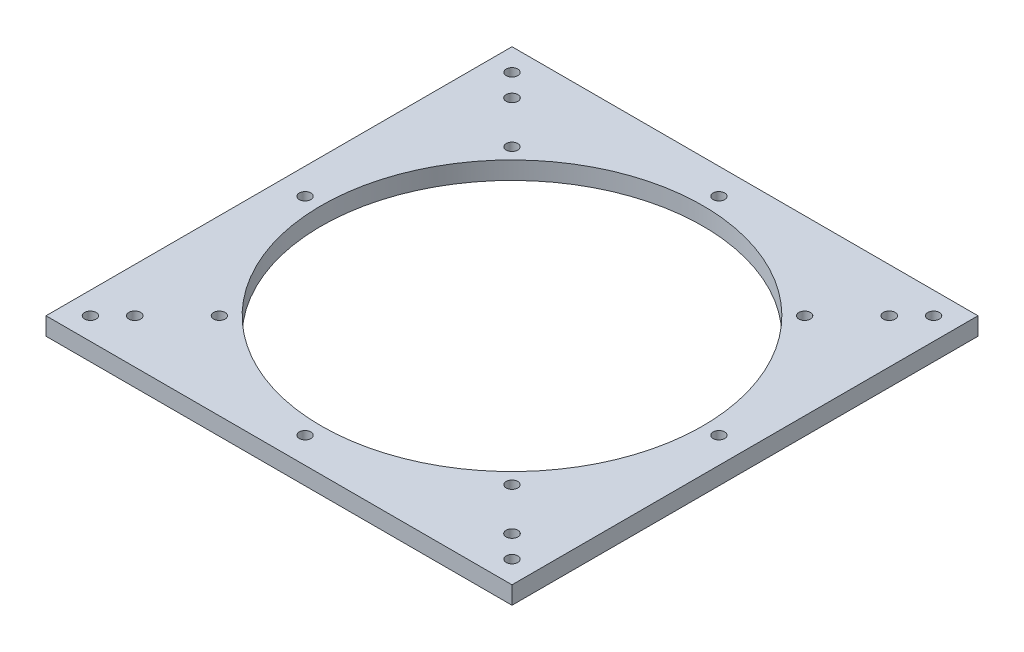
ISO-10303-21;
HEADER;
FILE_DESCRIPTION(('STEP AP214'),'2;1');
FILE_NAME('part.step','',(''),(''),'','','');
FILE_SCHEMA(('AUTOMOTIVE_DESIGN { 1 0 10303 214 1 1 1 1 }'));
ENDSEC;
DATA;
#1=APPLICATION_CONTEXT('core data for automotive mechanical design processes');
#2=APPLICATION_PROTOCOL_DEFINITION('international standard','automotive_design',2000,#1);
#3=PRODUCT_CONTEXT('',#1,'mechanical');
#4=PRODUCT('Part','Part','',(#3));
#5=PRODUCT_RELATED_PRODUCT_CATEGORY('part','',(#4));
#6=PRODUCT_DEFINITION_FORMATION('','',#4);
#7=PRODUCT_DEFINITION_CONTEXT('part definition',#1,'design');
#8=PRODUCT_DEFINITION('design','',#6,#7);
#9=PRODUCT_DEFINITION_SHAPE('','',#8);
#10=(LENGTH_UNIT() NAMED_UNIT(*) SI_UNIT(.MILLI.,.METRE.));
#11=(NAMED_UNIT(*) PLANE_ANGLE_UNIT() SI_UNIT($,.RADIAN.));
#12=(NAMED_UNIT(*) SI_UNIT($,.STERADIAN.) SOLID_ANGLE_UNIT());
#13=UNCERTAINTY_MEASURE_WITH_UNIT(LENGTH_MEASURE(1.E-05),#10,'distance_accuracy_value','');
#14=(GEOMETRIC_REPRESENTATION_CONTEXT(3) GLOBAL_UNCERTAINTY_ASSIGNED_CONTEXT((#13)) GLOBAL_UNIT_ASSIGNED_CONTEXT((#10,
#11,#12)) REPRESENTATION_CONTEXT('',''));
#15=CARTESIAN_POINT('',(0.,0.,0.));
#16=DIRECTION('',(0.,0.,1.));
#17=DIRECTION('',(1.,0.,0.));
#18=AXIS2_PLACEMENT_3D('',#15,#16,#17);
#19=CARTESIAN_POINT('',(0.,8.,105.));
#20=DIRECTION('',(0.,0.,-1.));
#21=DIRECTION('',(-1.,0.,0.));
#22=AXIS2_PLACEMENT_3D('',#19,#20,#21);
#23=PLANE('',#22);
#24=DIRECTION('',(1.,0.,0.));
#25=VECTOR('',#24,1.);
#26=CARTESIAN_POINT('',(0.,0.,105.));
#27=LINE('',#26,#25);
#28=CARTESIAN_POINT('',(-105.,0.,105.));
#29=VERTEX_POINT('',#28);
#30=CARTESIAN_POINT('',(105.,0.,105.));
#31=VERTEX_POINT('',#30);
#32=EDGE_CURVE('E134',#29,#31,#27,.T.);
#33=ORIENTED_EDGE('',*,*,#32,.T.);
#34=DIRECTION('',(0.,-1.,0.));
#35=VECTOR('',#34,1.);
#36=CARTESIAN_POINT('',(105.,8.,105.));
#37=LINE('',#36,#35);
#38=CARTESIAN_POINT('',(105.,8.,105.));
#39=VERTEX_POINT('',#38);
#40=EDGE_CURVE('E11',#39,#31,#37,.T.);
#41=ORIENTED_EDGE('',*,*,#40,.F.);
#42=DIRECTION('',(1.,0.,0.));
#43=VECTOR('',#42,1.);
#44=CARTESIAN_POINT('',(0.,8.,105.));
#45=LINE('',#44,#43);
#46=CARTESIAN_POINT('',(-105.,8.,105.));
#47=VERTEX_POINT('',#46);
#48=EDGE_CURVE('E99',#47,#39,#45,.T.);
#49=ORIENTED_EDGE('',*,*,#48,.F.);
#50=DIRECTION('',(0.,-1.,0.));
#51=VECTOR('',#50,1.);
#52=CARTESIAN_POINT('',(-105.,8.,105.));
#53=LINE('',#52,#51);
#54=EDGE_CURVE('E65',#47,#29,#53,.T.);
#55=ORIENTED_EDGE('',*,*,#54,.T.);
#56=EDGE_LOOP('',(#33,#41,#49,#55));
#57=FACE_BOUND('',#56,.T.);
#58=ADVANCED_FACE('F46',(#57),#23,.F.);
#59=CARTESIAN_POINT('',(105.,8.,0.));
#60=DIRECTION('',(-1.,0.,0.));
#61=DIRECTION('',(0.,0.,1.));
#62=AXIS2_PLACEMENT_3D('',#59,#60,#61);
#63=PLANE('',#62);
#64=DIRECTION('',(0.,0.,-1.));
#65=VECTOR('',#64,1.);
#66=CARTESIAN_POINT('',(105.,0.,0.));
#67=LINE('',#66,#65);
#68=CARTESIAN_POINT('',(105.,0.,-105.));
#69=VERTEX_POINT('',#68);
#70=EDGE_CURVE('E105',#31,#69,#67,.T.);
#71=ORIENTED_EDGE('',*,*,#70,.T.);
#72=DIRECTION('',(0.,-1.,0.));
#73=VECTOR('',#72,1.);
#74=CARTESIAN_POINT('',(105.,8.,-105.));
#75=LINE('',#74,#73);
#76=CARTESIAN_POINT('',(105.,8.,-105.));
#77=VERTEX_POINT('',#76);
#78=EDGE_CURVE('E56',#77,#69,#75,.T.);
#79=ORIENTED_EDGE('',*,*,#78,.F.);
#80=DIRECTION('',(0.,0.,-1.));
#81=VECTOR('',#80,1.);
#82=CARTESIAN_POINT('',(105.,8.,0.));
#83=LINE('',#82,#81);
#84=EDGE_CURVE('E90',#39,#77,#83,.T.);
#85=ORIENTED_EDGE('',*,*,#84,.F.);
#86=ORIENTED_EDGE('',*,*,#40,.T.);
#87=EDGE_LOOP('',(#71,#79,#85,#86));
#88=FACE_BOUND('',#87,.T.);
#89=ADVANCED_FACE('F104',(#88),#63,.F.);
#90=CARTESIAN_POINT('',(0.,8.,-105.));
#91=DIRECTION('',(0.,0.,-1.));
#92=DIRECTION('',(-1.,0.,0.));
#93=AXIS2_PLACEMENT_3D('',#90,#91,#92);
#94=PLANE('',#93);
#95=DIRECTION('',(1.,0.,0.));
#96=VECTOR('',#95,1.);
#97=CARTESIAN_POINT('',(0.,0.,-105.));
#98=LINE('',#97,#96);
#99=CARTESIAN_POINT('',(-105.,0.,-105.));
#100=VERTEX_POINT('',#99);
#101=EDGE_CURVE('E140',#100,#69,#98,.T.);
#102=ORIENTED_EDGE('',*,*,#101,.F.);
#103=DIRECTION('',(0.,-1.,0.));
#104=VECTOR('',#103,1.);
#105=CARTESIAN_POINT('',(-105.,8.,-105.));
#106=LINE('',#105,#104);
#107=CARTESIAN_POINT('',(-105.,8.,-105.));
#108=VERTEX_POINT('',#107);
#109=EDGE_CURVE('E79',#108,#100,#106,.T.);
#110=ORIENTED_EDGE('',*,*,#109,.F.);
#111=DIRECTION('',(1.,0.,0.));
#112=VECTOR('',#111,1.);
#113=CARTESIAN_POINT('',(0.,8.,-105.));
#114=LINE('',#113,#112);
#115=EDGE_CURVE('E98',#108,#77,#114,.T.);
#116=ORIENTED_EDGE('',*,*,#115,.T.);
#117=ORIENTED_EDGE('',*,*,#78,.T.);
#118=EDGE_LOOP('',(#102,#110,#116,#117));
#119=FACE_BOUND('',#118,.T.);
#120=ADVANCED_FACE('F110',(#119),#94,.T.);
#121=CARTESIAN_POINT('',(-6.51161269694244E-13,8.,93.25));
#122=DIRECTION('',(0.,-1.,0.));
#123=DIRECTION('',(0.,0.,-1.));
#124=AXIS2_PLACEMENT_3D('',#121,#122,#123);
#125=CYLINDRICAL_SURFACE('',#124,2.6);
#126=CARTESIAN_POINT('',(-6.51161269694244E-13,8.,93.25));
#127=DIRECTION('',(0.,1.,0.));
#128=DIRECTION('',(0.,0.,1.));
#129=AXIS2_PLACEMENT_3D('',#126,#127,#128);
#130=CIRCLE('',#129,2.6);
#131=CARTESIAN_POINT('',(-6.51161269694244E-13,8.,95.85));
#132=VERTEX_POINT('',#131);
#133=EDGE_CURVE('E126',#132,#132,#130,.T.);
#134=ORIENTED_EDGE('',*,*,#133,.T.);
#135=EDGE_LOOP('',(#134));
#136=FACE_BOUND('',#135,.T.);
#137=CARTESIAN_POINT('',(-6.51161269694244E-13,0.,93.25));
#138=DIRECTION('',(0.,1.,0.));
#139=DIRECTION('',(0.,0.,1.));
#140=AXIS2_PLACEMENT_3D('',#137,#138,#139);
#141=CIRCLE('',#140,2.6);
#142=CARTESIAN_POINT('',(-6.51161269694244E-13,0.,95.85));
#143=VERTEX_POINT('',#142);
#144=EDGE_CURVE('E155',#143,#143,#141,.T.);
#145=ORIENTED_EDGE('',*,*,#144,.F.);
#146=EDGE_LOOP('',(#145));
#147=FACE_BOUND('',#146,.T.);
#148=ADVANCED_FACE('F243',(#136,#147),#125,.F.);
#149=CARTESIAN_POINT('',(-93.25,8.,-9.76741904541367E-13));
#150=DIRECTION('',(0.,-1.,0.));
#151=DIRECTION('',(0.,0.,-1.));
#152=AXIS2_PLACEMENT_3D('',#149,#150,#151);
#153=CYLINDRICAL_SURFACE('',#152,2.6);
#154=CARTESIAN_POINT('',(-93.25,8.,-9.76741904541367E-13));
#155=DIRECTION('',(0.,1.,0.));
#156=DIRECTION('',(0.,0.,1.));
#157=AXIS2_PLACEMENT_3D('',#154,#155,#156);
#158=CIRCLE('',#157,2.6);
#159=CARTESIAN_POINT('',(-93.25,8.,2.59999999999902));
#160=VERTEX_POINT('',#159);
#161=EDGE_CURVE('E122',#160,#160,#158,.T.);
#162=ORIENTED_EDGE('',*,*,#161,.T.);
#163=EDGE_LOOP('',(#162));
#164=FACE_BOUND('',#163,.T.);
#165=CARTESIAN_POINT('',(-93.25,0.,-9.76741904541367E-13));
#166=DIRECTION('',(0.,1.,0.));
#167=DIRECTION('',(0.,0.,1.));
#168=AXIS2_PLACEMENT_3D('',#165,#166,#167);
#169=CIRCLE('',#168,2.6);
#170=CARTESIAN_POINT('',(-93.25,0.,2.59999999999902));
#171=VERTEX_POINT('',#170);
#172=EDGE_CURVE('E151',#171,#171,#169,.T.);
#173=ORIENTED_EDGE('',*,*,#172,.F.);
#174=EDGE_LOOP('',(#173));
#175=FACE_BOUND('',#174,.T.);
#176=ADVANCED_FACE('F237',(#164,#175),#153,.F.);
#177=CARTESIAN_POINT('',(0.,8.,-93.25));
#178=DIRECTION('',(0.,-1.,0.));
#179=DIRECTION('',(0.,0.,-1.));
#180=AXIS2_PLACEMENT_3D('',#177,#178,#179);
#181=CYLINDRICAL_SURFACE('',#180,2.6);
#182=CARTESIAN_POINT('',(0.,8.,-93.25));
#183=DIRECTION('',(0.,1.,0.));
#184=DIRECTION('',(0.,0.,1.));
#185=AXIS2_PLACEMENT_3D('',#182,#183,#184);
#186=CIRCLE('',#185,2.6);
#187=CARTESIAN_POINT('',(0.,8.,-90.65));
#188=VERTEX_POINT('',#187);
#189=EDGE_CURVE('E115',#188,#188,#186,.T.);
#190=ORIENTED_EDGE('',*,*,#189,.T.);
#191=EDGE_LOOP('',(#190));
#192=FACE_BOUND('',#191,.T.);
#193=CARTESIAN_POINT('',(0.,0.,-93.25));
#194=DIRECTION('',(0.,1.,0.));
#195=DIRECTION('',(0.,0.,1.));
#196=AXIS2_PLACEMENT_3D('',#193,#194,#195);
#197=CIRCLE('',#196,2.6);
#198=CARTESIAN_POINT('',(0.,0.,-90.65));
#199=VERTEX_POINT('',#198);
#200=EDGE_CURVE('E147',#199,#199,#197,.T.);
#201=ORIENTED_EDGE('',*,*,#200,.F.);
#202=EDGE_LOOP('',(#201));
#203=FACE_BOUND('',#202,.T.);
#204=ADVANCED_FACE('F229',(#192,#203),#181,.F.);
#205=CARTESIAN_POINT('',(-105.,8.,0.));
#206=DIRECTION('',(-1.,0.,0.));
#207=DIRECTION('',(0.,0.,1.));
#208=AXIS2_PLACEMENT_3D('',#205,#206,#207);
#209=PLANE('',#208);
#210=DIRECTION('',(0.,0.,-1.));
#211=VECTOR('',#210,1.);
#212=CARTESIAN_POINT('',(-105.,0.,0.));
#213=LINE('',#212,#211);
#214=EDGE_CURVE('E143',#29,#100,#213,.T.);
#215=ORIENTED_EDGE('',*,*,#214,.F.);
#216=ORIENTED_EDGE('',*,*,#54,.F.);
#217=DIRECTION('',(0.,0.,-1.));
#218=VECTOR('',#217,1.);
#219=CARTESIAN_POINT('',(-105.,8.,0.));
#220=LINE('',#219,#218);
#221=EDGE_CURVE('E112',#47,#108,#220,.T.);
#222=ORIENTED_EDGE('',*,*,#221,.T.);
#223=ORIENTED_EDGE('',*,*,#109,.T.);
#224=EDGE_LOOP('',(#215,#216,#222,#223));
#225=FACE_BOUND('',#224,.T.);
#226=ADVANCED_FACE('F226',(#225),#209,.T.);
#227=CARTESIAN_POINT('',(93.25,8.,3.25580634847122E-13));
#228=DIRECTION('',(0.,-1.,0.));
#229=DIRECTION('',(0.,0.,-1.));
#230=AXIS2_PLACEMENT_3D('',#227,#228,#229);
#231=CYLINDRICAL_SURFACE('',#230,2.6);
#232=CARTESIAN_POINT('',(93.25,8.,3.25580634847122E-13));
#233=DIRECTION('',(0.,1.,0.));
#234=DIRECTION('',(0.,0.,1.));
#235=AXIS2_PLACEMENT_3D('',#232,#233,#234);
#236=CIRCLE('',#235,2.6);
#237=CARTESIAN_POINT('',(93.25,8.,2.60000000000033));
#238=VERTEX_POINT('',#237);
#239=EDGE_CURVE('E130',#238,#238,#236,.T.);
#240=ORIENTED_EDGE('',*,*,#239,.T.);
#241=EDGE_LOOP('',(#240));
#242=FACE_BOUND('',#241,.T.);
#243=CARTESIAN_POINT('',(93.25,0.,3.25580634847122E-13));
#244=DIRECTION('',(0.,1.,0.));
#245=DIRECTION('',(0.,0.,1.));
#246=AXIS2_PLACEMENT_3D('',#243,#244,#245);
#247=CIRCLE('',#246,2.6);
#248=CARTESIAN_POINT('',(93.25,0.,2.60000000000033));
#249=VERTEX_POINT('',#248);
#250=EDGE_CURVE('E159',#249,#249,#247,.T.);
#251=ORIENTED_EDGE('',*,*,#250,.F.);
#252=EDGE_LOOP('',(#251));
#253=FACE_BOUND('',#252,.T.);
#254=ADVANCED_FACE('F228',(#242,#253),#231,.F.);
#255=CARTESIAN_POINT('',(0.,8.,0.));
#256=DIRECTION('',(0.,1.,0.));
#257=DIRECTION('',(0.,0.,1.));
#258=AXIS2_PLACEMENT_3D('',#255,#256,#257);
#259=PLANE('',#258);
#260=CARTESIAN_POINT('',(84.9999999999993,8.,85.0000000000006));
#261=DIRECTION('',(0.,1.,0.));
#262=DIRECTION('',(0.,0.,1.));
#263=AXIS2_PLACEMENT_3D('',#260,#261,#262);
#264=CIRCLE('',#263,2.64999999999999);
#265=CARTESIAN_POINT('',(84.9999999999993,8.,87.6500000000005));
#266=VERTEX_POINT('',#265);
#267=EDGE_CURVE('E346',#266,#266,#264,.T.);
#268=ORIENTED_EDGE('',*,*,#267,.F.);
#269=EDGE_LOOP('',(#268));
#270=FACE_BOUND('',#269,.T.);
#271=CARTESIAN_POINT('',(-85.,8.,-85.));
#272=DIRECTION('',(0.,1.,0.));
#273=DIRECTION('',(0.,0.,1.));
#274=AXIS2_PLACEMENT_3D('',#271,#272,#273);
#275=CIRCLE('',#274,2.65);
#276=CARTESIAN_POINT('',(-85.,8.,-82.35));
#277=VERTEX_POINT('',#276);
#278=EDGE_CURVE('E336',#277,#277,#275,.T.);
#279=ORIENTED_EDGE('',*,*,#278,.F.);
#280=EDGE_LOOP('',(#279));
#281=FACE_BOUND('',#280,.T.);
#282=CARTESIAN_POINT('',(-85.0000000000009,8.,84.9999999999991));
#283=DIRECTION('',(0.,1.,0.));
#284=DIRECTION('',(0.,0.,1.));
#285=AXIS2_PLACEMENT_3D('',#282,#283,#284);
#286=CIRCLE('',#285,2.65000000000001);
#287=CARTESIAN_POINT('',(-85.0000000000009,8.,87.6499999999991));
#288=VERTEX_POINT('',#287);
#289=EDGE_CURVE('E326',#288,#288,#286,.T.);
#290=ORIENTED_EDGE('',*,*,#289,.F.);
#291=EDGE_LOOP('',(#290));
#292=FACE_BOUND('',#291,.T.);
#293=CARTESIAN_POINT('',(85.0000000000003,8.,-84.9999999999997));
#294=DIRECTION('',(0.,1.,0.));
#295=DIRECTION('',(0.,0.,1.));
#296=AXIS2_PLACEMENT_3D('',#293,#294,#295);
#297=CIRCLE('',#296,2.65000000000001);
#298=CARTESIAN_POINT('',(85.0000000000003,8.,-82.3499999999996));
#299=VERTEX_POINT('',#298);
#300=EDGE_CURVE('E329',#299,#299,#297,.T.);
#301=ORIENTED_EDGE('',*,*,#300,.F.);
#302=EDGE_LOOP('',(#301));
#303=FACE_BOUND('',#302,.T.);
#304=CARTESIAN_POINT('',(0.,8.,0.));
#305=DIRECTION('',(0.,1.,0.));
#306=DIRECTION('',(0.,0.,1.));
#307=AXIS2_PLACEMENT_3D('',#304,#305,#306);
#308=CIRCLE('',#307,86.);
#309=CARTESIAN_POINT('',(0.,8.,86.));
#310=VERTEX_POINT('',#309);
#311=EDGE_CURVE('E356',#310,#310,#308,.T.);
#312=ORIENTED_EDGE('',*,*,#311,.F.);
#313=EDGE_LOOP('',(#312));
#314=FACE_BOUND('',#313,.T.);
#315=CARTESIAN_POINT('',(-65.9377073456461,8.,65.937707345645));
#316=DIRECTION('',(0.,1.,0.));
#317=DIRECTION('',(0.,0.,1.));
#318=AXIS2_PLACEMENT_3D('',#315,#316,#317);
#319=CIRCLE('',#318,2.59999999999999);
#320=CARTESIAN_POINT('',(-65.9377073456461,8.,68.537707345645));
#321=VERTEX_POINT('',#320);
#322=EDGE_CURVE('E365',#321,#321,#319,.T.);
#323=ORIENTED_EDGE('',*,*,#322,.F.);
#324=EDGE_LOOP('',(#323));
#325=FACE_BOUND('',#324,.T.);
#326=CARTESIAN_POINT('',(65.9377073456457,8.,-65.9377073456454));
#327=DIRECTION('',(0.,1.,0.));
#328=DIRECTION('',(0.,0.,1.));
#329=AXIS2_PLACEMENT_3D('',#326,#327,#328);
#330=CIRCLE('',#329,2.59999999999999);
#331=CARTESIAN_POINT('',(65.9377073456457,8.,-63.3377073456454));
#332=VERTEX_POINT('',#331);
#333=EDGE_CURVE('E373',#332,#332,#330,.T.);
#334=ORIENTED_EDGE('',*,*,#333,.F.);
#335=EDGE_LOOP('',(#334));
#336=FACE_BOUND('',#335,.T.);
#337=CARTESIAN_POINT('',(-65.9377073456447,8.,-65.9377073456464));
#338=DIRECTION('',(0.,1.,0.));
#339=DIRECTION('',(0.,0.,1.));
#340=AXIS2_PLACEMENT_3D('',#337,#338,#339);
#341=CIRCLE('',#340,2.6);
#342=CARTESIAN_POINT('',(-65.9377073456447,8.,-63.3377073456464));
#343=VERTEX_POINT('',#342);
#344=EDGE_CURVE('E377',#343,#343,#341,.T.);
#345=ORIENTED_EDGE('',*,*,#344,.F.);
#346=EDGE_LOOP('',(#345));
#347=FACE_BOUND('',#346,.T.);
#348=CARTESIAN_POINT('',(95.0000000000003,8.,-94.9999999999996));
#349=DIRECTION('',(0.,1.,0.));
#350=DIRECTION('',(0.,0.,1.));
#351=AXIS2_PLACEMENT_3D('',#348,#349,#350);
#352=CIRCLE('',#351,2.6);
#353=CARTESIAN_POINT('',(95.0000000000003,8.,-92.3999999999996));
#354=VERTEX_POINT('',#353);
#355=EDGE_CURVE('E281',#354,#354,#352,.T.);
#356=ORIENTED_EDGE('',*,*,#355,.F.);
#357=EDGE_LOOP('',(#356));
#358=FACE_BOUND('',#357,.T.);
#359=CARTESIAN_POINT('',(94.9999999999993,8.,95.0000000000007));
#360=DIRECTION('',(0.,1.,0.));
#361=DIRECTION('',(0.,0.,1.));
#362=AXIS2_PLACEMENT_3D('',#359,#360,#361);
#363=CIRCLE('',#362,2.6);
#364=CARTESIAN_POINT('',(94.9999999999993,8.,97.6000000000007));
#365=VERTEX_POINT('',#364);
#366=EDGE_CURVE('E361',#365,#365,#363,.T.);
#367=ORIENTED_EDGE('',*,*,#366,.F.);
#368=EDGE_LOOP('',(#367));
#369=FACE_BOUND('',#368,.T.);
#370=CARTESIAN_POINT('',(-95.000000000001,8.,94.9999999999989));
#371=DIRECTION('',(0.,1.,0.));
#372=DIRECTION('',(0.,0.,1.));
#373=AXIS2_PLACEMENT_3D('',#370,#371,#372);
#374=CIRCLE('',#373,2.6);
#375=CARTESIAN_POINT('',(-95.000000000001,8.,97.599999999999));
#376=VERTEX_POINT('',#375);
#377=EDGE_CURVE('E366',#376,#376,#374,.T.);
#378=ORIENTED_EDGE('',*,*,#377,.F.);
#379=EDGE_LOOP('',(#378));
#380=FACE_BOUND('',#379,.T.);
#381=CARTESIAN_POINT('',(-95.,8.,-95.));
#382=DIRECTION('',(0.,1.,0.));
#383=DIRECTION('',(0.,0.,1.));
#384=AXIS2_PLACEMENT_3D('',#381,#382,#383);
#385=CIRCLE('',#384,2.6);
#386=CARTESIAN_POINT('',(-95.,8.,-92.4));
#387=VERTEX_POINT('',#386);
#388=EDGE_CURVE('E370',#387,#387,#385,.T.);
#389=ORIENTED_EDGE('',*,*,#388,.F.);
#390=EDGE_LOOP('',(#389));
#391=FACE_BOUND('',#390,.T.);
#392=CARTESIAN_POINT('',(65.9377073456452,8.,65.9377073456459));
#393=DIRECTION('',(0.,1.,0.));
#394=DIRECTION('',(0.,0.,1.));
#395=AXIS2_PLACEMENT_3D('',#392,#393,#394);
#396=CIRCLE('',#395,2.60000000000001);
#397=CARTESIAN_POINT('',(65.9377073456452,8.,68.5377073456459));
#398=VERTEX_POINT('',#397);
#399=EDGE_CURVE('E172',#398,#398,#396,.T.);
#400=ORIENTED_EDGE('',*,*,#399,.F.);
#401=EDGE_LOOP('',(#400));
#402=FACE_BOUND('',#401,.T.);
#403=ORIENTED_EDGE('',*,*,#48,.T.);
#404=ORIENTED_EDGE('',*,*,#84,.T.);
#405=ORIENTED_EDGE('',*,*,#115,.F.);
#406=ORIENTED_EDGE('',*,*,#221,.F.);
#407=EDGE_LOOP('',(#403,#404,#405,#406));
#408=FACE_BOUND('',#407,.T.);
#409=ORIENTED_EDGE('',*,*,#189,.F.);
#410=EDGE_LOOP('',(#409));
#411=FACE_BOUND('',#410,.T.);
#412=ORIENTED_EDGE('',*,*,#161,.F.);
#413=EDGE_LOOP('',(#412));
#414=FACE_BOUND('',#413,.T.);
#415=ORIENTED_EDGE('',*,*,#133,.F.);
#416=EDGE_LOOP('',(#415));
#417=FACE_BOUND('',#416,.T.);
#418=ORIENTED_EDGE('',*,*,#239,.F.);
#419=EDGE_LOOP('',(#418));
#420=FACE_BOUND('',#419,.T.);
#421=ADVANCED_FACE('F94',(#270,#281,#292,#303,#314,#325,#336,#347,#358,#369,#380,#391,#402,#408,
#411,#414,#417,#420),#259,.T.);
#422=CARTESIAN_POINT('',(0.,0.,0.));
#423=DIRECTION('',(0.,1.,0.));
#424=DIRECTION('',(0.,0.,1.));
#425=AXIS2_PLACEMENT_3D('',#422,#423,#424);
#426=PLANE('',#425);
#427=CARTESIAN_POINT('',(84.9999999999993,0.,85.0000000000006));
#428=DIRECTION('',(0.,1.,0.));
#429=DIRECTION('',(0.,0.,1.));
#430=AXIS2_PLACEMENT_3D('',#427,#428,#429);
#431=CIRCLE('',#430,2.64999999999999);
#432=CARTESIAN_POINT('',(84.9999999999993,0.,87.6500000000005));
#433=VERTEX_POINT('',#432);
#434=EDGE_CURVE('E350',#433,#433,#431,.T.);
#435=ORIENTED_EDGE('',*,*,#434,.T.);
#436=EDGE_LOOP('',(#435));
#437=FACE_BOUND('',#436,.T.);
#438=CARTESIAN_POINT('',(-85.,0.,-85.));
#439=DIRECTION('',(0.,1.,0.));
#440=DIRECTION('',(0.,0.,1.));
#441=AXIS2_PLACEMENT_3D('',#438,#439,#440);
#442=CIRCLE('',#441,2.65);
#443=CARTESIAN_POINT('',(-85.,0.,-82.35));
#444=VERTEX_POINT('',#443);
#445=EDGE_CURVE('E342',#444,#444,#442,.T.);
#446=ORIENTED_EDGE('',*,*,#445,.T.);
#447=EDGE_LOOP('',(#446));
#448=FACE_BOUND('',#447,.T.);
#449=CARTESIAN_POINT('',(-85.0000000000009,0.,84.9999999999991));
#450=DIRECTION('',(0.,1.,0.));
#451=DIRECTION('',(0.,0.,1.));
#452=AXIS2_PLACEMENT_3D('',#449,#450,#451);
#453=CIRCLE('',#452,2.65000000000001);
#454=CARTESIAN_POINT('',(-85.0000000000009,0.,87.6499999999991));
#455=VERTEX_POINT('',#454);
#456=EDGE_CURVE('E323',#455,#455,#453,.T.);
#457=ORIENTED_EDGE('',*,*,#456,.T.);
#458=EDGE_LOOP('',(#457));
#459=FACE_BOUND('',#458,.T.);
#460=CARTESIAN_POINT('',(85.0000000000003,0.,-84.9999999999997));
#461=DIRECTION('',(0.,1.,0.));
#462=DIRECTION('',(0.,0.,1.));
#463=AXIS2_PLACEMENT_3D('',#460,#461,#462);
#464=CIRCLE('',#463,2.65000000000001);
#465=CARTESIAN_POINT('',(85.0000000000003,0.,-82.3499999999996));
#466=VERTEX_POINT('',#465);
#467=EDGE_CURVE('E334',#466,#466,#464,.T.);
#468=ORIENTED_EDGE('',*,*,#467,.T.);
#469=EDGE_LOOP('',(#468));
#470=FACE_BOUND('',#469,.T.);
#471=CARTESIAN_POINT('',(0.,0.,0.));
#472=DIRECTION('',(0.,1.,0.));
#473=DIRECTION('',(0.,0.,1.));
#474=AXIS2_PLACEMENT_3D('',#471,#472,#473);
#475=CIRCLE('',#474,86.);
#476=CARTESIAN_POINT('',(0.,0.,86.));
#477=VERTEX_POINT('',#476);
#478=EDGE_CURVE('E49',#477,#477,#475,.T.);
#479=ORIENTED_EDGE('',*,*,#478,.T.);
#480=EDGE_LOOP('',(#479));
#481=FACE_BOUND('',#480,.T.);
#482=CARTESIAN_POINT('',(-65.9377073456461,0.,65.937707345645));
#483=DIRECTION('',(0.,1.,0.));
#484=DIRECTION('',(0.,0.,1.));
#485=AXIS2_PLACEMENT_3D('',#482,#483,#484);
#486=CIRCLE('',#485,2.59999999999999);
#487=CARTESIAN_POINT('',(-65.9377073456461,0.,68.537707345645));
#488=VERTEX_POINT('',#487);
#489=EDGE_CURVE('E137',#488,#488,#486,.T.);
#490=ORIENTED_EDGE('',*,*,#489,.T.);
#491=EDGE_LOOP('',(#490));
#492=FACE_BOUND('',#491,.T.);
#493=CARTESIAN_POINT('',(65.9377073456457,0.,-65.9377073456454));
#494=DIRECTION('',(0.,1.,0.));
#495=DIRECTION('',(0.,0.,1.));
#496=AXIS2_PLACEMENT_3D('',#493,#494,#495);
#497=CIRCLE('',#496,2.59999999999999);
#498=CARTESIAN_POINT('',(65.9377073456457,0.,-63.3377073456454));
#499=VERTEX_POINT('',#498);
#500=EDGE_CURVE('E192',#499,#499,#497,.T.);
#501=ORIENTED_EDGE('',*,*,#500,.T.);
#502=EDGE_LOOP('',(#501));
#503=FACE_BOUND('',#502,.T.);
#504=CARTESIAN_POINT('',(-65.9377073456447,0.,-65.9377073456464));
#505=DIRECTION('',(0.,1.,0.));
#506=DIRECTION('',(0.,0.,1.));
#507=AXIS2_PLACEMENT_3D('',#504,#505,#506);
#508=CIRCLE('',#507,2.6);
#509=CARTESIAN_POINT('',(-65.9377073456447,0.,-63.3377073456464));
#510=VERTEX_POINT('',#509);
#511=EDGE_CURVE('E188',#510,#510,#508,.T.);
#512=ORIENTED_EDGE('',*,*,#511,.T.);
#513=EDGE_LOOP('',(#512));
#514=FACE_BOUND('',#513,.T.);
#515=CARTESIAN_POINT('',(95.0000000000003,0.,-94.9999999999996));
#516=DIRECTION('',(0.,1.,0.));
#517=DIRECTION('',(0.,0.,1.));
#518=AXIS2_PLACEMENT_3D('',#515,#516,#517);
#519=CIRCLE('',#518,2.6);
#520=CARTESIAN_POINT('',(95.0000000000003,0.,-92.3999999999996));
#521=VERTEX_POINT('',#520);
#522=EDGE_CURVE('E184',#521,#521,#519,.T.);
#523=ORIENTED_EDGE('',*,*,#522,.T.);
#524=EDGE_LOOP('',(#523));
#525=FACE_BOUND('',#524,.T.);
#526=CARTESIAN_POINT('',(94.9999999999993,0.,95.0000000000007));
#527=DIRECTION('',(0.,1.,0.));
#528=DIRECTION('',(0.,0.,1.));
#529=AXIS2_PLACEMENT_3D('',#526,#527,#528);
#530=CIRCLE('',#529,2.6);
#531=CARTESIAN_POINT('',(94.9999999999993,0.,97.6000000000007));
#532=VERTEX_POINT('',#531);
#533=EDGE_CURVE('E180',#532,#532,#530,.T.);
#534=ORIENTED_EDGE('',*,*,#533,.T.);
#535=EDGE_LOOP('',(#534));
#536=FACE_BOUND('',#535,.T.);
#537=CARTESIAN_POINT('',(-95.000000000001,0.,94.9999999999989));
#538=DIRECTION('',(0.,1.,0.));
#539=DIRECTION('',(0.,0.,1.));
#540=AXIS2_PLACEMENT_3D('',#537,#538,#539);
#541=CIRCLE('',#540,2.6);
#542=CARTESIAN_POINT('',(-95.000000000001,0.,97.599999999999));
#543=VERTEX_POINT('',#542);
#544=EDGE_CURVE('E176',#543,#543,#541,.T.);
#545=ORIENTED_EDGE('',*,*,#544,.T.);
#546=EDGE_LOOP('',(#545));
#547=FACE_BOUND('',#546,.T.);
#548=CARTESIAN_POINT('',(-95.,0.,-95.));
#549=DIRECTION('',(0.,1.,0.));
#550=DIRECTION('',(0.,0.,1.));
#551=AXIS2_PLACEMENT_3D('',#548,#549,#550);
#552=CIRCLE('',#551,2.6);
#553=CARTESIAN_POINT('',(-95.,0.,-92.4));
#554=VERTEX_POINT('',#553);
#555=EDGE_CURVE('E171',#554,#554,#552,.T.);
#556=ORIENTED_EDGE('',*,*,#555,.T.);
#557=EDGE_LOOP('',(#556));
#558=FACE_BOUND('',#557,.T.);
#559=CARTESIAN_POINT('',(65.9377073456452,0.,65.9377073456459));
#560=DIRECTION('',(0.,1.,0.));
#561=DIRECTION('',(0.,0.,1.));
#562=AXIS2_PLACEMENT_3D('',#559,#560,#561);
#563=CIRCLE('',#562,2.60000000000001);
#564=CARTESIAN_POINT('',(65.9377073456452,0.,68.5377073456459));
#565=VERTEX_POINT('',#564);
#566=EDGE_CURVE('E167',#565,#565,#563,.T.);
#567=ORIENTED_EDGE('',*,*,#566,.T.);
#568=EDGE_LOOP('',(#567));
#569=FACE_BOUND('',#568,.T.);
#570=ORIENTED_EDGE('',*,*,#32,.F.);
#571=ORIENTED_EDGE('',*,*,#214,.T.);
#572=ORIENTED_EDGE('',*,*,#101,.T.);
#573=ORIENTED_EDGE('',*,*,#70,.F.);
#574=EDGE_LOOP('',(#570,#571,#572,#573));
#575=FACE_BOUND('',#574,.T.);
#576=ORIENTED_EDGE('',*,*,#200,.T.);
#577=EDGE_LOOP('',(#576));
#578=FACE_BOUND('',#577,.T.);
#579=ORIENTED_EDGE('',*,*,#172,.T.);
#580=EDGE_LOOP('',(#579));
#581=FACE_BOUND('',#580,.T.);
#582=ORIENTED_EDGE('',*,*,#144,.T.);
#583=EDGE_LOOP('',(#582));
#584=FACE_BOUND('',#583,.T.);
#585=ORIENTED_EDGE('',*,*,#250,.T.);
#586=EDGE_LOOP('',(#585));
#587=FACE_BOUND('',#586,.T.);
#588=ADVANCED_FACE('F199',(#437,#448,#459,#470,#481,#492,#503,#514,#525,#536,#547,#558,#569,
#575,#578,#581,#584,#587),#426,.F.);
#589=CARTESIAN_POINT('',(65.9377073456452,-2.,65.9377073456459));
#590=DIRECTION('',(0.,1.,0.));
#591=DIRECTION('',(0.,0.,1.));
#592=AXIS2_PLACEMENT_3D('',#589,#590,#591);
#593=CYLINDRICAL_SURFACE('',#592,2.60000000000001);
#594=ORIENTED_EDGE('',*,*,#399,.T.);
#595=EDGE_LOOP('',(#594));
#596=FACE_BOUND('',#595,.T.);
#597=ORIENTED_EDGE('',*,*,#566,.F.);
#598=EDGE_LOOP('',(#597));
#599=FACE_BOUND('',#598,.T.);
#600=ADVANCED_FACE('F257',(#596,#599),#593,.F.);
#601=CARTESIAN_POINT('',(-95.,-2.,-95.));
#602=DIRECTION('',(0.,1.,0.));
#603=DIRECTION('',(0.,0.,1.));
#604=AXIS2_PLACEMENT_3D('',#601,#602,#603);
#605=CYLINDRICAL_SURFACE('',#604,2.6);
#606=ORIENTED_EDGE('',*,*,#388,.T.);
#607=EDGE_LOOP('',(#606));
#608=FACE_BOUND('',#607,.T.);
#609=ORIENTED_EDGE('',*,*,#555,.F.);
#610=EDGE_LOOP('',(#609));
#611=FACE_BOUND('',#610,.T.);
#612=ADVANCED_FACE('F264',(#608,#611),#605,.F.);
#613=CARTESIAN_POINT('',(-95.000000000001,-2.,94.9999999999989));
#614=DIRECTION('',(0.,1.,0.));
#615=DIRECTION('',(0.,0.,1.));
#616=AXIS2_PLACEMENT_3D('',#613,#614,#615);
#617=CYLINDRICAL_SURFACE('',#616,2.6);
#618=ORIENTED_EDGE('',*,*,#377,.T.);
#619=EDGE_LOOP('',(#618));
#620=FACE_BOUND('',#619,.T.);
#621=ORIENTED_EDGE('',*,*,#544,.F.);
#622=EDGE_LOOP('',(#621));
#623=FACE_BOUND('',#622,.T.);
#624=ADVANCED_FACE('F275',(#620,#623),#617,.F.);
#625=CARTESIAN_POINT('',(94.9999999999993,-2.,95.0000000000007));
#626=DIRECTION('',(0.,1.,0.));
#627=DIRECTION('',(0.,0.,1.));
#628=AXIS2_PLACEMENT_3D('',#625,#626,#627);
#629=CYLINDRICAL_SURFACE('',#628,2.6);
#630=ORIENTED_EDGE('',*,*,#366,.T.);
#631=EDGE_LOOP('',(#630));
#632=FACE_BOUND('',#631,.T.);
#633=ORIENTED_EDGE('',*,*,#533,.F.);
#634=EDGE_LOOP('',(#633));
#635=FACE_BOUND('',#634,.T.);
#636=ADVANCED_FACE('F270',(#632,#635),#629,.F.);
#637=CARTESIAN_POINT('',(95.0000000000003,-2.,-94.9999999999996));
#638=DIRECTION('',(0.,1.,0.));
#639=DIRECTION('',(0.,0.,1.));
#640=AXIS2_PLACEMENT_3D('',#637,#638,#639);
#641=CYLINDRICAL_SURFACE('',#640,2.6);
#642=ORIENTED_EDGE('',*,*,#355,.T.);
#643=EDGE_LOOP('',(#642));
#644=FACE_BOUND('',#643,.T.);
#645=ORIENTED_EDGE('',*,*,#522,.F.);
#646=EDGE_LOOP('',(#645));
#647=FACE_BOUND('',#646,.T.);
#648=ADVANCED_FACE('F267',(#644,#647),#641,.F.);
#649=CARTESIAN_POINT('',(-65.9377073456447,-2.,-65.9377073456464));
#650=DIRECTION('',(0.,1.,0.));
#651=DIRECTION('',(0.,0.,1.));
#652=AXIS2_PLACEMENT_3D('',#649,#650,#651);
#653=CYLINDRICAL_SURFACE('',#652,2.6);
#654=ORIENTED_EDGE('',*,*,#344,.T.);
#655=EDGE_LOOP('',(#654));
#656=FACE_BOUND('',#655,.T.);
#657=ORIENTED_EDGE('',*,*,#511,.F.);
#658=EDGE_LOOP('',(#657));
#659=FACE_BOUND('',#658,.T.);
#660=ADVANCED_FACE('F215',(#656,#659),#653,.F.);
#661=CARTESIAN_POINT('',(65.9377073456457,-2.,-65.9377073456454));
#662=DIRECTION('',(0.,1.,0.));
#663=DIRECTION('',(0.,0.,1.));
#664=AXIS2_PLACEMENT_3D('',#661,#662,#663);
#665=CYLINDRICAL_SURFACE('',#664,2.59999999999999);
#666=ORIENTED_EDGE('',*,*,#333,.T.);
#667=EDGE_LOOP('',(#666));
#668=FACE_BOUND('',#667,.T.);
#669=ORIENTED_EDGE('',*,*,#500,.F.);
#670=EDGE_LOOP('',(#669));
#671=FACE_BOUND('',#670,.T.);
#672=ADVANCED_FACE('F205',(#668,#671),#665,.F.);
#673=CARTESIAN_POINT('',(-65.9377073456461,-2.,65.937707345645));
#674=DIRECTION('',(0.,1.,0.));
#675=DIRECTION('',(0.,0.,1.));
#676=AXIS2_PLACEMENT_3D('',#673,#674,#675);
#677=CYLINDRICAL_SURFACE('',#676,2.59999999999999);
#678=ORIENTED_EDGE('',*,*,#322,.T.);
#679=EDGE_LOOP('',(#678));
#680=FACE_BOUND('',#679,.T.);
#681=ORIENTED_EDGE('',*,*,#489,.F.);
#682=EDGE_LOOP('',(#681));
#683=FACE_BOUND('',#682,.T.);
#684=ADVANCED_FACE('F202',(#680,#683),#677,.F.);
#685=CARTESIAN_POINT('',(0.,-2.,0.));
#686=DIRECTION('',(0.,1.,0.));
#687=DIRECTION('',(0.,0.,1.));
#688=AXIS2_PLACEMENT_3D('',#685,#686,#687);
#689=CYLINDRICAL_SURFACE('',#688,86.);
#690=ORIENTED_EDGE('',*,*,#311,.T.);
#691=EDGE_LOOP('',(#690));
#692=FACE_BOUND('',#691,.T.);
#693=ORIENTED_EDGE('',*,*,#478,.F.);
#694=EDGE_LOOP('',(#693));
#695=FACE_BOUND('',#694,.T.);
#696=ADVANCED_FACE('F204',(#692,#695),#689,.F.);
#697=CARTESIAN_POINT('',(85.0000000000003,0.,-84.9999999999997));
#698=DIRECTION('',(0.,1.,0.));
#699=DIRECTION('',(0.,0.,1.));
#700=AXIS2_PLACEMENT_3D('',#697,#698,#699);
#701=CYLINDRICAL_SURFACE('',#700,2.65000000000001);
#702=ORIENTED_EDGE('',*,*,#467,.F.);
#703=EDGE_LOOP('',(#702));
#704=FACE_BOUND('',#703,.T.);
#705=ORIENTED_EDGE('',*,*,#300,.T.);
#706=EDGE_LOOP('',(#705));
#707=FACE_BOUND('',#706,.T.);
#708=ADVANCED_FACE('F212',(#704,#707),#701,.F.);
#709=CARTESIAN_POINT('',(-85.0000000000009,0.,84.9999999999991));
#710=DIRECTION('',(0.,1.,0.));
#711=DIRECTION('',(0.,0.,1.));
#712=AXIS2_PLACEMENT_3D('',#709,#710,#711);
#713=CYLINDRICAL_SURFACE('',#712,2.65000000000001);
#714=ORIENTED_EDGE('',*,*,#456,.F.);
#715=EDGE_LOOP('',(#714));
#716=FACE_BOUND('',#715,.T.);
#717=ORIENTED_EDGE('',*,*,#289,.T.);
#718=EDGE_LOOP('',(#717));
#719=FACE_BOUND('',#718,.T.);
#720=ADVANCED_FACE('F306',(#716,#719),#713,.F.);
#721=CARTESIAN_POINT('',(-85.,0.,-85.));
#722=DIRECTION('',(0.,1.,0.));
#723=DIRECTION('',(0.,0.,1.));
#724=AXIS2_PLACEMENT_3D('',#721,#722,#723);
#725=CYLINDRICAL_SURFACE('',#724,2.65);
#726=ORIENTED_EDGE('',*,*,#445,.F.);
#727=EDGE_LOOP('',(#726));
#728=FACE_BOUND('',#727,.T.);
#729=ORIENTED_EDGE('',*,*,#278,.T.);
#730=EDGE_LOOP('',(#729));
#731=FACE_BOUND('',#730,.T.);
#732=ADVANCED_FACE('F311',(#728,#731),#725,.F.);
#733=CARTESIAN_POINT('',(84.9999999999993,0.,85.0000000000006));
#734=DIRECTION('',(0.,1.,0.));
#735=DIRECTION('',(0.,0.,1.));
#736=AXIS2_PLACEMENT_3D('',#733,#734,#735);
#737=CYLINDRICAL_SURFACE('',#736,2.64999999999999);
#738=ORIENTED_EDGE('',*,*,#434,.F.);
#739=EDGE_LOOP('',(#738));
#740=FACE_BOUND('',#739,.T.);
#741=ORIENTED_EDGE('',*,*,#267,.T.);
#742=EDGE_LOOP('',(#741));
#743=FACE_BOUND('',#742,.T.);
#744=ADVANCED_FACE('F308',(#740,#743),#737,.F.);
#745=CLOSED_SHELL('',(#58,#89,#120,#148,#176,#204,#226,#254,#421,#588,#600,#612,#624,#636,#648,
#660,#672,#684,#696,#708,#720,#732,#744));
#746=MANIFOLD_SOLID_BREP('B2',#745);
#747=ADVANCED_BREP_SHAPE_REPRESENTATION('',(#18,#746),#14);
#748=SHAPE_DEFINITION_REPRESENTATION(#9,#747);
ENDSEC;
END-ISO-10303-21;
